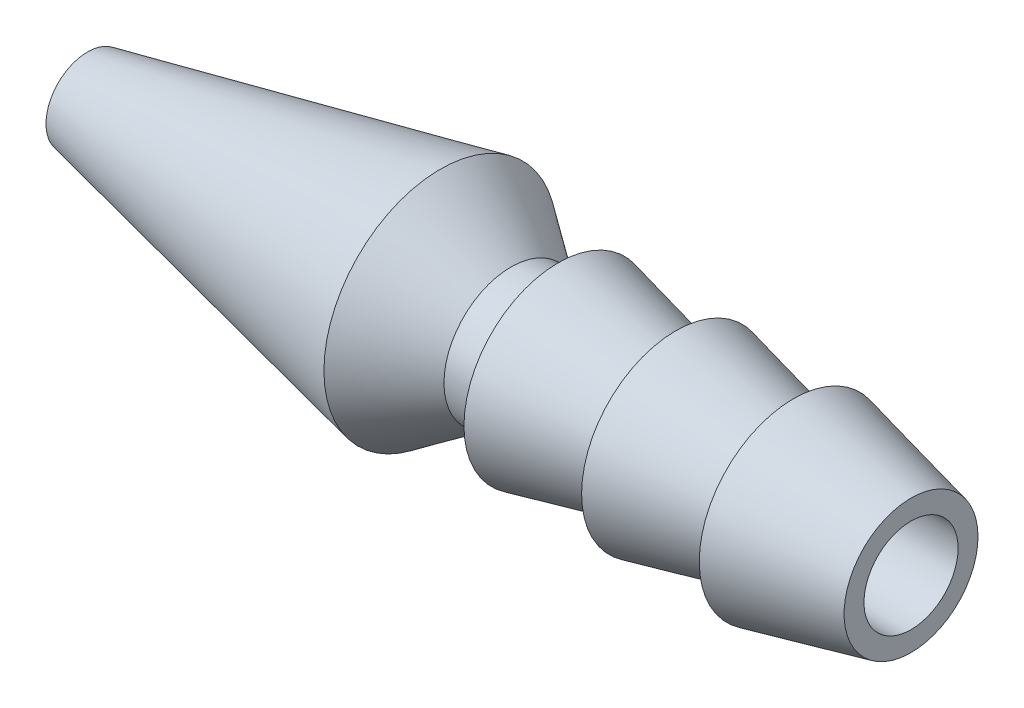
ISO-10303-21;
HEADER;
FILE_DESCRIPTION(('STEP AP214'),'2;1');
FILE_NAME('part.step','',(''),(''),'','','');
FILE_SCHEMA(('AUTOMOTIVE_DESIGN { 1 0 10303 214 1 1 1 1 }'));
ENDSEC;
DATA;
#1=APPLICATION_CONTEXT('core data for automotive mechanical design processes');
#2=APPLICATION_PROTOCOL_DEFINITION('international standard','automotive_design',2000,#1);
#3=PRODUCT_CONTEXT('',#1,'mechanical');
#4=PRODUCT('Part','Part','',(#3));
#5=PRODUCT_RELATED_PRODUCT_CATEGORY('part','',(#4));
#6=PRODUCT_DEFINITION_FORMATION('','',#4);
#7=PRODUCT_DEFINITION_CONTEXT('part definition',#1,'design');
#8=PRODUCT_DEFINITION('design','',#6,#7);
#9=PRODUCT_DEFINITION_SHAPE('','',#8);
#10=(LENGTH_UNIT() NAMED_UNIT(*) SI_UNIT(.MILLI.,.METRE.));
#11=(NAMED_UNIT(*) PLANE_ANGLE_UNIT() SI_UNIT($,.RADIAN.));
#12=(NAMED_UNIT(*) SI_UNIT($,.STERADIAN.) SOLID_ANGLE_UNIT());
#13=UNCERTAINTY_MEASURE_WITH_UNIT(LENGTH_MEASURE(1.E-05),#10,'distance_accuracy_value','');
#14=(GEOMETRIC_REPRESENTATION_CONTEXT(3) GLOBAL_UNCERTAINTY_ASSIGNED_CONTEXT((#13)) GLOBAL_UNIT_ASSIGNED_CONTEXT((#10,
#11,#12)) REPRESENTATION_CONTEXT('',''));
#15=CARTESIAN_POINT('',(0.,0.,0.));
#16=DIRECTION('',(0.,0.,1.));
#17=DIRECTION('',(1.,0.,0.));
#18=AXIS2_PLACEMENT_3D('',#15,#16,#17);
#19=CARTESIAN_POINT('',(0.,0.,0.));
#20=DIRECTION('',(-1.,0.,0.));
#21=DIRECTION('',(0.,0.,-1.));
#22=AXIS2_PLACEMENT_3D('',#19,#20,#21);
#23=CONICAL_SURFACE('',#22,4.,0.226892802759263);
#24=CARTESIAN_POINT('',(5.,0.,0.));
#25=DIRECTION('',(1.,0.,0.));
#26=DIRECTION('',(0.,0.,-1.));
#27=AXIS2_PLACEMENT_3D('',#24,#25,#26);
#28=CIRCLE('',#27,2.84565904437218);
#29=CARTESIAN_POINT('',(5.,0.,-2.84565904437218));
#30=VERTEX_POINT('',#29);
#31=EDGE_CURVE('E42',#30,#30,#28,.T.);
#32=ORIENTED_EDGE('',*,*,#31,.F.);
#33=EDGE_LOOP('',(#32));
#34=FACE_BOUND('',#33,.T.);
#35=CARTESIAN_POINT('',(0.,0.,0.));
#36=DIRECTION('',(1.,0.,0.));
#37=DIRECTION('',(0.,0.,-1.));
#38=AXIS2_PLACEMENT_3D('',#35,#36,#37);
#39=CIRCLE('',#38,4.);
#40=CARTESIAN_POINT('',(0.,0.,-4.));
#41=VERTEX_POINT('',#40);
#42=EDGE_CURVE('E47',#41,#41,#39,.T.);
#43=ORIENTED_EDGE('',*,*,#42,.T.);
#44=EDGE_LOOP('',(#43));
#45=FACE_BOUND('',#44,.T.);
#46=ADVANCED_FACE('F33',(#34,#45),#23,.T.);
#47=CARTESIAN_POINT('',(0.,0.,0.));
#48=DIRECTION('',(1.,0.,0.));
#49=DIRECTION('',(0.,0.,-1.));
#50=AXIS2_PLACEMENT_3D('',#47,#48,#49);
#51=PLANE('',#50);
#52=CARTESIAN_POINT('',(0.,0.,0.));
#53=DIRECTION('',(-1.,0.,0.));
#54=DIRECTION('',(0.,0.,1.));
#55=AXIS2_PLACEMENT_3D('',#52,#53,#54);
#56=CIRCLE('',#55,2.85);
#57=CARTESIAN_POINT('',(0.,0.,2.85));
#58=VERTEX_POINT('',#57);
#59=EDGE_CURVE('E10',#58,#58,#56,.T.);
#60=ORIENTED_EDGE('',*,*,#59,.F.);
#61=EDGE_LOOP('',(#60));
#62=FACE_BOUND('',#61,.T.);
#63=ORIENTED_EDGE('',*,*,#42,.F.);
#64=EDGE_LOOP('',(#63));
#65=FACE_BOUND('',#64,.T.);
#66=ADVANCED_FACE('F133',(#62,#65),#51,.F.);
#67=CARTESIAN_POINT('',(5.,0.,0.));
#68=DIRECTION('',(-1.,0.,0.));
#69=DIRECTION('',(0.,0.,-1.));
#70=AXIS2_PLACEMENT_3D('',#67,#68,#69);
#71=CONICAL_SURFACE('',#70,4.,0.226892802759263);
#72=CARTESIAN_POINT('',(10.,0.,0.));
#73=DIRECTION('',(1.,0.,0.));
#74=DIRECTION('',(0.,0.,-1.));
#75=AXIS2_PLACEMENT_3D('',#72,#73,#74);
#76=CIRCLE('',#75,2.84565904437218);
#77=CARTESIAN_POINT('',(10.,0.,-2.84565904437218));
#78=VERTEX_POINT('',#77);
#79=EDGE_CURVE('E62',#78,#78,#76,.T.);
#80=ORIENTED_EDGE('',*,*,#79,.F.);
#81=EDGE_LOOP('',(#80));
#82=FACE_BOUND('',#81,.T.);
#83=CARTESIAN_POINT('',(5.,0.,0.));
#84=DIRECTION('',(1.,0.,0.));
#85=DIRECTION('',(0.,0.,-1.));
#86=AXIS2_PLACEMENT_3D('',#83,#84,#85);
#87=CIRCLE('',#86,4.);
#88=CARTESIAN_POINT('',(5.,0.,-4.));
#89=VERTEX_POINT('',#88);
#90=EDGE_CURVE('E59',#89,#89,#87,.T.);
#91=ORIENTED_EDGE('',*,*,#90,.T.);
#92=EDGE_LOOP('',(#91));
#93=FACE_BOUND('',#92,.T.);
#94=ADVANCED_FACE('F130',(#82,#93),#71,.T.);
#95=CARTESIAN_POINT('',(5.,0.,0.));
#96=DIRECTION('',(1.,0.,0.));
#97=DIRECTION('',(0.,0.,-1.));
#98=AXIS2_PLACEMENT_3D('',#95,#96,#97);
#99=PLANE('',#98);
#100=ORIENTED_EDGE('',*,*,#31,.T.);
#101=EDGE_LOOP('',(#100));
#102=FACE_BOUND('',#101,.T.);
#103=ORIENTED_EDGE('',*,*,#90,.F.);
#104=EDGE_LOOP('',(#103));
#105=FACE_BOUND('',#104,.T.);
#106=ADVANCED_FACE('F126',(#102,#105),#99,.F.);
#107=CARTESIAN_POINT('',(10.,0.,0.));
#108=DIRECTION('',(-1.,0.,0.));
#109=DIRECTION('',(0.,0.,-1.));
#110=AXIS2_PLACEMENT_3D('',#107,#108,#109);
#111=CONICAL_SURFACE('',#110,4.,0.226892802759263);
#112=CARTESIAN_POINT('',(15.,0.,0.));
#113=DIRECTION('',(1.,0.,0.));
#114=DIRECTION('',(0.,0.,-1.));
#115=AXIS2_PLACEMENT_3D('',#112,#113,#114);
#116=CIRCLE('',#115,2.84565904437218);
#117=CARTESIAN_POINT('',(15.,0.,-2.84565904437218));
#118=VERTEX_POINT('',#117);
#119=EDGE_CURVE('E56',#118,#118,#116,.T.);
#120=ORIENTED_EDGE('',*,*,#119,.F.);
#121=EDGE_LOOP('',(#120));
#122=FACE_BOUND('',#121,.T.);
#123=CARTESIAN_POINT('',(10.,0.,0.));
#124=DIRECTION('',(1.,0.,0.));
#125=DIRECTION('',(0.,0.,-1.));
#126=AXIS2_PLACEMENT_3D('',#123,#124,#125);
#127=CIRCLE('',#126,4.);
#128=CARTESIAN_POINT('',(10.,0.,-4.));
#129=VERTEX_POINT('',#128);
#130=EDGE_CURVE('E53',#129,#129,#127,.T.);
#131=ORIENTED_EDGE('',*,*,#130,.T.);
#132=EDGE_LOOP('',(#131));
#133=FACE_BOUND('',#132,.T.);
#134=ADVANCED_FACE('F119',(#122,#133),#111,.T.);
#135=CARTESIAN_POINT('',(15.,0.,0.));
#136=DIRECTION('',(1.,0.,0.));
#137=DIRECTION('',(0.,0.,-1.));
#138=AXIS2_PLACEMENT_3D('',#135,#136,#137);
#139=PLANE('',#138);
#140=CARTESIAN_POINT('',(15.,0.,0.));
#141=DIRECTION('',(1.,0.,0.));
#142=DIRECTION('',(0.,0.,-1.));
#143=AXIS2_PLACEMENT_3D('',#140,#141,#142);
#144=CIRCLE('',#143,2.);
#145=CARTESIAN_POINT('',(15.,0.,-2.));
#146=VERTEX_POINT('',#145);
#147=EDGE_CURVE('E74',#146,#146,#144,.T.);
#148=ORIENTED_EDGE('',*,*,#147,.F.);
#149=EDGE_LOOP('',(#148));
#150=FACE_BOUND('',#149,.T.);
#151=ORIENTED_EDGE('',*,*,#119,.T.);
#152=EDGE_LOOP('',(#151));
#153=FACE_BOUND('',#152,.T.);
#154=ADVANCED_FACE('F116',(#150,#153),#139,.T.);
#155=CARTESIAN_POINT('',(10.,0.,0.));
#156=DIRECTION('',(1.,0.,0.));
#157=DIRECTION('',(0.,0.,-1.));
#158=AXIS2_PLACEMENT_3D('',#155,#156,#157);
#159=PLANE('',#158);
#160=ORIENTED_EDGE('',*,*,#79,.T.);
#161=EDGE_LOOP('',(#160));
#162=FACE_BOUND('',#161,.T.);
#163=ORIENTED_EDGE('',*,*,#130,.F.);
#164=EDGE_LOOP('',(#163));
#165=FACE_BOUND('',#164,.T.);
#166=ADVANCED_FACE('F114',(#162,#165),#159,.F.);
#167=CARTESIAN_POINT('',(-2.,0.,0.));
#168=DIRECTION('',(1.,0.,0.));
#169=DIRECTION('',(0.,0.,-1.));
#170=AXIS2_PLACEMENT_3D('',#167,#168,#169);
#171=CYLINDRICAL_SURFACE('',#170,2.85);
#172=CARTESIAN_POINT('',(-2.,0.,0.));
#173=DIRECTION('',(-1.,0.,0.));
#174=DIRECTION('',(0.,0.,1.));
#175=AXIS2_PLACEMENT_3D('',#172,#173,#174);
#176=CIRCLE('',#175,2.85);
#177=CARTESIAN_POINT('',(-2.,0.,2.85));
#178=VERTEX_POINT('',#177);
#179=EDGE_CURVE('E51',#178,#178,#176,.T.);
#180=ORIENTED_EDGE('',*,*,#179,.F.);
#181=EDGE_LOOP('',(#180));
#182=FACE_BOUND('',#181,.T.);
#183=ORIENTED_EDGE('',*,*,#59,.T.);
#184=EDGE_LOOP('',(#183));
#185=FACE_BOUND('',#184,.T.);
#186=ADVANCED_FACE('F110',(#182,#185),#171,.T.);
#187=CARTESIAN_POINT('',(-2.,0.,0.));
#188=DIRECTION('',(-1.,0.,0.));
#189=DIRECTION('',(0.,0.,1.));
#190=AXIS2_PLACEMENT_3D('',#187,#188,#189);
#191=CONICAL_SURFACE('',#190,2.85,0.610865238198016);
#192=CARTESIAN_POINT('',(-5.,0.,0.));
#193=DIRECTION('',(-1.,0.,0.));
#194=DIRECTION('',(0.,0.,1.));
#195=AXIS2_PLACEMENT_3D('',#192,#193,#194);
#196=CIRCLE('',#195,4.95062261462913);
#197=CARTESIAN_POINT('',(-5.,0.,4.95062261462913));
#198=VERTEX_POINT('',#197);
#199=EDGE_CURVE('E234',#198,#198,#196,.T.);
#200=ORIENTED_EDGE('',*,*,#199,.F.);
#201=EDGE_LOOP('',(#200));
#202=FACE_BOUND('',#201,.T.);
#203=ORIENTED_EDGE('',*,*,#179,.T.);
#204=EDGE_LOOP('',(#203));
#205=FACE_BOUND('',#204,.T.);
#206=ADVANCED_FACE('F106',(#202,#205),#191,.T.);
#207=CARTESIAN_POINT('',(-5.,0.,0.));
#208=DIRECTION('',(1.,0.,0.));
#209=DIRECTION('',(0.,0.,1.));
#210=AXIS2_PLACEMENT_3D('',#207,#208,#209);
#211=CONICAL_SURFACE('',#210,4.95062261462913,0.20943951023932);
#212=CARTESIAN_POINT('',(-20.,0.,0.));
#213=DIRECTION('',(-1.,0.,0.));
#214=DIRECTION('',(0.,0.,1.));
#215=AXIS2_PLACEMENT_3D('',#212,#213,#214);
#216=CIRCLE('',#215,1.7622741895788);
#217=CARTESIAN_POINT('',(-20.,0.,1.7622741895788));
#218=VERTEX_POINT('',#217);
#219=EDGE_CURVE('E77',#218,#218,#216,.T.);
#220=ORIENTED_EDGE('',*,*,#219,.F.);
#221=EDGE_LOOP('',(#220));
#222=FACE_BOUND('',#221,.T.);
#223=ORIENTED_EDGE('',*,*,#199,.T.);
#224=EDGE_LOOP('',(#223));
#225=FACE_BOUND('',#224,.T.);
#226=ADVANCED_FACE('F102',(#222,#225),#211,.T.);
#227=CARTESIAN_POINT('',(-20.,0.,0.));
#228=DIRECTION('',(-1.,0.,0.));
#229=DIRECTION('',(0.,0.,1.));
#230=AXIS2_PLACEMENT_3D('',#227,#228,#229);
#231=PLANE('',#230);
#232=CARTESIAN_POINT('',(-20.,0.,0.));
#233=DIRECTION('',(-1.,0.,0.));
#234=DIRECTION('',(0.,0.,1.));
#235=AXIS2_PLACEMENT_3D('',#232,#233,#234);
#236=CIRCLE('',#235,0.75);
#237=CARTESIAN_POINT('',(-20.,0.,0.75));
#238=VERTEX_POINT('',#237);
#239=EDGE_CURVE('E75',#238,#238,#236,.T.);
#240=ORIENTED_EDGE('',*,*,#239,.F.);
#241=EDGE_LOOP('',(#240));
#242=FACE_BOUND('',#241,.T.);
#243=ORIENTED_EDGE('',*,*,#219,.T.);
#244=EDGE_LOOP('',(#243));
#245=FACE_BOUND('',#244,.T.);
#246=ADVANCED_FACE('F99',(#242,#245),#231,.T.);
#247=CARTESIAN_POINT('',(-5.,0.,0.));
#248=DIRECTION('',(1.,0.,0.));
#249=DIRECTION('',(0.,0.,-1.));
#250=AXIS2_PLACEMENT_3D('',#247,#248,#249);
#251=CYLINDRICAL_SURFACE('',#250,2.);
#252=CARTESIAN_POINT('',(-5.,0.,0.));
#253=DIRECTION('',(-1.,0.,0.));
#254=DIRECTION('',(0.,0.,-1.));
#255=AXIS2_PLACEMENT_3D('',#252,#253,#254);
#256=CIRCLE('',#255,2.);
#257=CARTESIAN_POINT('',(-5.,0.,-2.));
#258=VERTEX_POINT('',#257);
#259=EDGE_CURVE('E69',#258,#258,#256,.T.);
#260=ORIENTED_EDGE('',*,*,#259,.T.);
#261=EDGE_LOOP('',(#260));
#262=FACE_BOUND('',#261,.T.);
#263=ORIENTED_EDGE('',*,*,#147,.T.);
#264=EDGE_LOOP('',(#263));
#265=FACE_BOUND('',#264,.T.);
#266=ADVANCED_FACE('F70',(#262,#265),#251,.F.);
#267=CARTESIAN_POINT('',(-20.,0.,0.));
#268=DIRECTION('',(1.,0.,0.));
#269=DIRECTION('',(0.,0.,1.));
#270=AXIS2_PLACEMENT_3D('',#267,#268,#269);
#271=CONICAL_SURFACE('',#270,0.75,0.083775804095728);
#272=ORIENTED_EDGE('',*,*,#259,.F.);
#273=EDGE_LOOP('',(#272));
#274=FACE_BOUND('',#273,.T.);
#275=ORIENTED_EDGE('',*,*,#239,.T.);
#276=EDGE_LOOP('',(#275));
#277=FACE_BOUND('',#276,.T.);
#278=ADVANCED_FACE('F88',(#274,#277),#271,.F.);
#279=CLOSED_SHELL('',(#46,#66,#94,#106,#134,#154,#166,#186,#206,#226,#246,#266,#278));
#280=MANIFOLD_SOLID_BREP('B2',#279);
#281=ADVANCED_BREP_SHAPE_REPRESENTATION('',(#18,#280),#14);
#282=SHAPE_DEFINITION_REPRESENTATION(#9,#281);
ENDSEC;
END-ISO-10303-21;
